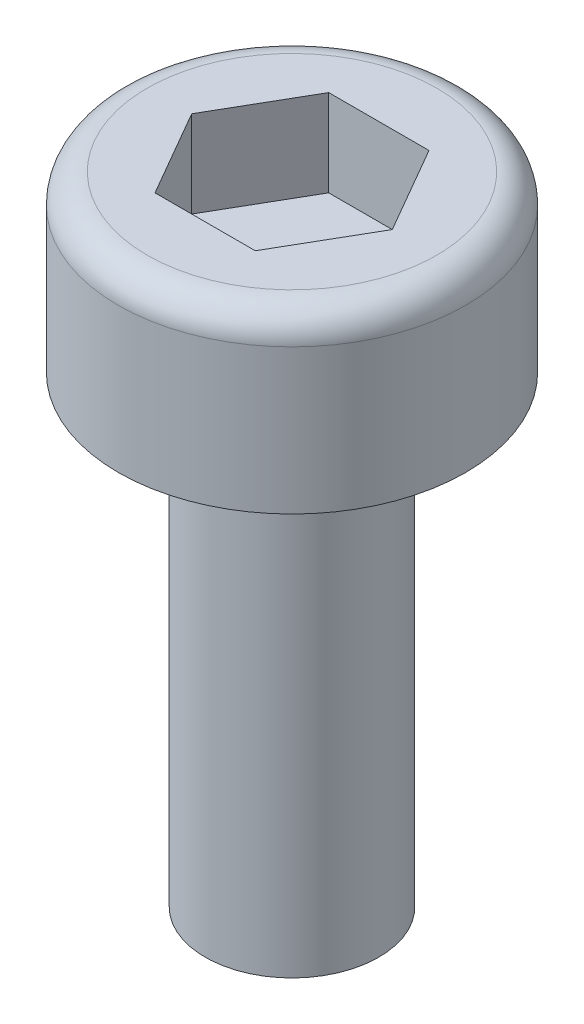
ISO-10303-21;
HEADER;
FILE_DESCRIPTION(('STEP AP214'),'2;1');
FILE_NAME('part.step','',(''),(''),'','','');
FILE_SCHEMA(('AUTOMOTIVE_DESIGN { 1 0 10303 214 1 1 1 1 }'));
ENDSEC;
DATA;
#1=APPLICATION_CONTEXT('core data for automotive mechanical design processes');
#2=APPLICATION_PROTOCOL_DEFINITION('international standard','automotive_design',2000,#1);
#3=PRODUCT_CONTEXT('',#1,'mechanical');
#4=PRODUCT('Part','Part','',(#3));
#5=PRODUCT_RELATED_PRODUCT_CATEGORY('part','',(#4));
#6=PRODUCT_DEFINITION_FORMATION('','',#4);
#7=PRODUCT_DEFINITION_CONTEXT('part definition',#1,'design');
#8=PRODUCT_DEFINITION('design','',#6,#7);
#9=PRODUCT_DEFINITION_SHAPE('','',#8);
#10=(LENGTH_UNIT() NAMED_UNIT(*) SI_UNIT(.MILLI.,.METRE.));
#11=(NAMED_UNIT(*) PLANE_ANGLE_UNIT() SI_UNIT($,.RADIAN.));
#12=(NAMED_UNIT(*) SI_UNIT($,.STERADIAN.) SOLID_ANGLE_UNIT());
#13=UNCERTAINTY_MEASURE_WITH_UNIT(LENGTH_MEASURE(1.E-05),#10,'distance_accuracy_value','');
#14=(GEOMETRIC_REPRESENTATION_CONTEXT(3) GLOBAL_UNCERTAINTY_ASSIGNED_CONTEXT((#13)) GLOBAL_UNIT_ASSIGNED_CONTEXT((#10,
#11,#12)) REPRESENTATION_CONTEXT('',''));
#15=CARTESIAN_POINT('',(0.,0.,0.));
#16=DIRECTION('',(0.,0.,1.));
#17=DIRECTION('',(1.,0.,0.));
#18=AXIS2_PLACEMENT_3D('',#15,#16,#17);
#19=CARTESIAN_POINT('',(0.,0.,0.));
#20=DIRECTION('',(0.,-1.,0.));
#21=DIRECTION('',(0.,0.,-1.));
#22=AXIS2_PLACEMENT_3D('',#19,#20,#21);
#23=PLANE('',#22);
#24=CARTESIAN_POINT('',(0.,0.,0.));
#25=DIRECTION('',(0.,-1.,0.));
#26=DIRECTION('',(0.,0.,-1.));
#27=AXIS2_PLACEMENT_3D('',#24,#25,#26);
#28=CIRCLE('',#27,3.);
#29=CARTESIAN_POINT('',(0.,0.,-3.));
#30=VERTEX_POINT('',#29);
#31=EDGE_CURVE('E145',#30,#30,#28,.T.);
#32=ORIENTED_EDGE('',*,*,#31,.T.);
#33=EDGE_LOOP('',(#32));
#34=FACE_BOUND('',#33,.T.);
#35=ADVANCED_FACE('F32',(#34),#23,.T.);
#36=CARTESIAN_POINT('',(0.,0.,0.));
#37=DIRECTION('',(0.,-1.,0.));
#38=DIRECTION('',(0.,0.,-1.));
#39=AXIS2_PLACEMENT_3D('',#36,#37,#38);
#40=CYLINDRICAL_SURFACE('',#39,3.);
#41=CARTESIAN_POINT('',(0.,16.,0.));
#42=DIRECTION('',(0.,-1.,0.));
#43=DIRECTION('',(0.,0.,-1.));
#44=AXIS2_PLACEMENT_3D('',#41,#42,#43);
#45=CIRCLE('',#44,3.);
#46=CARTESIAN_POINT('',(0.,16.,-3.));
#47=VERTEX_POINT('',#46);
#48=EDGE_CURVE('E142',#47,#47,#45,.T.);
#49=ORIENTED_EDGE('',*,*,#48,.T.);
#50=EDGE_LOOP('',(#49));
#51=FACE_BOUND('',#50,.T.);
#52=ORIENTED_EDGE('',*,*,#31,.F.);
#53=EDGE_LOOP('',(#52));
#54=FACE_BOUND('',#53,.T.);
#55=ADVANCED_FACE('F162',(#51,#54),#40,.T.);
#56=CARTESIAN_POINT('',(3.,16.,0.));
#57=DIRECTION('',(0.,-1.,0.));
#58=DIRECTION('',(0.,0.,-1.));
#59=AXIS2_PLACEMENT_3D('',#56,#57,#58);
#60=PLANE('',#59);
#61=CARTESIAN_POINT('',(0.,16.,0.));
#62=DIRECTION('',(0.,-1.,0.));
#63=DIRECTION('',(0.,0.,-1.));
#64=AXIS2_PLACEMENT_3D('',#61,#62,#63);
#65=CIRCLE('',#64,6.);
#66=CARTESIAN_POINT('',(0.,16.,-6.));
#67=VERTEX_POINT('',#66);
#68=EDGE_CURVE('E134',#67,#67,#65,.T.);
#69=ORIENTED_EDGE('',*,*,#68,.T.);
#70=EDGE_LOOP('',(#69));
#71=FACE_BOUND('',#70,.T.);
#72=ORIENTED_EDGE('',*,*,#48,.F.);
#73=EDGE_LOOP('',(#72));
#74=FACE_BOUND('',#73,.T.);
#75=ADVANCED_FACE('F167',(#71,#74),#60,.T.);
#76=CARTESIAN_POINT('',(0.,0.,0.));
#77=DIRECTION('',(0.,-1.,0.));
#78=DIRECTION('',(0.,0.,-1.));
#79=AXIS2_PLACEMENT_3D('',#76,#77,#78);
#80=CYLINDRICAL_SURFACE('',#79,6.);
#81=CARTESIAN_POINT('',(0.,21.,0.));
#82=DIRECTION('',(0.,1.,0.));
#83=DIRECTION('',(0.,0.,1.));
#84=AXIS2_PLACEMENT_3D('',#81,#82,#83);
#85=CIRCLE('',#84,6.);
#86=CARTESIAN_POINT('',(0.,21.,6.));
#87=VERTEX_POINT('',#86);
#88=EDGE_CURVE('E40',#87,#87,#85,.F.);
#89=ORIENTED_EDGE('',*,*,#88,.T.);
#90=EDGE_LOOP('',(#89));
#91=FACE_BOUND('',#90,.T.);
#92=ORIENTED_EDGE('',*,*,#68,.F.);
#93=EDGE_LOOP('',(#92));
#94=FACE_BOUND('',#93,.T.);
#95=ADVANCED_FACE('F150',(#91,#94),#80,.T.);
#96=CARTESIAN_POINT('',(6.,22.,0.));
#97=DIRECTION('',(0.,1.,0.));
#98=DIRECTION('',(0.,0.,1.));
#99=AXIS2_PLACEMENT_3D('',#96,#97,#98);
#100=PLANE('',#99);
#101=CARTESIAN_POINT('',(0.,22.,0.));
#102=DIRECTION('',(0.,1.,0.));
#103=DIRECTION('',(0.,0.,1.));
#104=AXIS2_PLACEMENT_3D('',#101,#102,#103);
#105=CIRCLE('',#104,5.);
#106=CARTESIAN_POINT('',(0.,22.,5.));
#107=VERTEX_POINT('',#106);
#108=EDGE_CURVE('E11',#107,#107,#105,.T.);
#109=ORIENTED_EDGE('',*,*,#108,.T.);
#110=EDGE_LOOP('',(#109));
#111=FACE_BOUND('',#110,.T.);
#112=DIRECTION('',(-0.5,0.,-0.866025403784438));
#113=VECTOR('',#112,1.);
#114=CARTESIAN_POINT('',(3.46410161513775,22.,0.));
#115=LINE('',#114,#113);
#116=CARTESIAN_POINT('',(3.46410161513775,22.,0.));
#117=VERTEX_POINT('',#116);
#118=CARTESIAN_POINT('',(1.73205080756888,22.,-3.));
#119=VERTEX_POINT('',#118);
#120=EDGE_CURVE('E47',#117,#119,#115,.T.);
#121=ORIENTED_EDGE('',*,*,#120,.F.);
#122=DIRECTION('',(0.5,0.,-0.866025403784439));
#123=VECTOR('',#122,1.);
#124=CARTESIAN_POINT('',(1.73205080756888,22.,3.));
#125=LINE('',#124,#123);
#126=CARTESIAN_POINT('',(1.73205080756888,22.,3.));
#127=VERTEX_POINT('',#126);
#128=EDGE_CURVE('E130',#127,#117,#125,.T.);
#129=ORIENTED_EDGE('',*,*,#128,.F.);
#130=DIRECTION('',(1.,0.,0.));
#131=VECTOR('',#130,1.);
#132=CARTESIAN_POINT('',(-1.73205080756888,22.,3.));
#133=LINE('',#132,#131);
#134=CARTESIAN_POINT('',(-1.73205080756888,22.,3.));
#135=VERTEX_POINT('',#134);
#136=EDGE_CURVE('E128',#135,#127,#133,.T.);
#137=ORIENTED_EDGE('',*,*,#136,.F.);
#138=DIRECTION('',(0.5,0.,0.866025403784438));
#139=VECTOR('',#138,1.);
#140=CARTESIAN_POINT('',(-3.46410161513775,22.,0.));
#141=LINE('',#140,#139);
#142=CARTESIAN_POINT('',(-3.46410161513775,22.,0.));
#143=VERTEX_POINT('',#142);
#144=EDGE_CURVE('E95',#143,#135,#141,.T.);
#145=ORIENTED_EDGE('',*,*,#144,.F.);
#146=DIRECTION('',(-0.5,0.,0.866025403784439));
#147=VECTOR('',#146,1.);
#148=CARTESIAN_POINT('',(-1.73205080756888,22.,-3.));
#149=LINE('',#148,#147);
#150=CARTESIAN_POINT('',(-1.73205080756888,22.,-3.));
#151=VERTEX_POINT('',#150);
#152=EDGE_CURVE('E124',#151,#143,#149,.T.);
#153=ORIENTED_EDGE('',*,*,#152,.F.);
#154=DIRECTION('',(-1.,0.,0.));
#155=VECTOR('',#154,1.);
#156=CARTESIAN_POINT('',(1.73205080756888,22.,-3.));
#157=LINE('',#156,#155);
#158=EDGE_CURVE('E121',#119,#151,#157,.T.);
#159=ORIENTED_EDGE('',*,*,#158,.F.);
#160=EDGE_LOOP('',(#121,#129,#137,#145,#153,#159));
#161=FACE_BOUND('',#160,.T.);
#162=ADVANCED_FACE('F176',(#111,#161),#100,.T.);
#163=CARTESIAN_POINT('',(3.46410161513775,19.,0.));
#164=DIRECTION('',(0.866025403784438,0.,-0.5));
#165=DIRECTION('',(-0.5,0.,-0.866025403784438));
#166=AXIS2_PLACEMENT_3D('',#163,#164,#165);
#167=PLANE('',#166);
#168=ORIENTED_EDGE('',*,*,#120,.T.);
#169=DIRECTION('',(0.,1.,0.));
#170=VECTOR('',#169,1.);
#171=CARTESIAN_POINT('',(1.73205080756888,19.,-3.));
#172=LINE('',#171,#170);
#173=CARTESIAN_POINT('',(1.73205080756888,19.,-3.));
#174=VERTEX_POINT('',#173);
#175=EDGE_CURVE('E77',#174,#119,#172,.T.);
#176=ORIENTED_EDGE('',*,*,#175,.F.);
#177=DIRECTION('',(-0.5,0.,-0.866025403784438));
#178=VECTOR('',#177,1.);
#179=CARTESIAN_POINT('',(3.46410161513775,19.,0.));
#180=LINE('',#179,#178);
#181=CARTESIAN_POINT('',(3.46410161513775,19.,0.));
#182=VERTEX_POINT('',#181);
#183=EDGE_CURVE('E132',#182,#174,#180,.T.);
#184=ORIENTED_EDGE('',*,*,#183,.F.);
#185=DIRECTION('',(0.,1.,0.));
#186=VECTOR('',#185,1.);
#187=CARTESIAN_POINT('',(3.46410161513775,19.,0.));
#188=LINE('',#187,#186);
#189=EDGE_CURVE('E55',#182,#117,#188,.T.);
#190=ORIENTED_EDGE('',*,*,#189,.T.);
#191=EDGE_LOOP('',(#168,#176,#184,#190));
#192=FACE_BOUND('',#191,.T.);
#193=ADVANCED_FACE('F179',(#192),#167,.F.);
#194=CARTESIAN_POINT('',(1.73205080756888,19.,3.));
#195=DIRECTION('',(0.866025403784438,0.,0.5));
#196=DIRECTION('',(0.5,0.,-0.866025403784439));
#197=AXIS2_PLACEMENT_3D('',#194,#195,#196);
#198=PLANE('',#197);
#199=ORIENTED_EDGE('',*,*,#128,.T.);
#200=ORIENTED_EDGE('',*,*,#189,.F.);
#201=DIRECTION('',(0.5,0.,-0.866025403784439));
#202=VECTOR('',#201,1.);
#203=CARTESIAN_POINT('',(1.73205080756888,19.,3.));
#204=LINE('',#203,#202);
#205=CARTESIAN_POINT('',(1.73205080756888,19.,3.));
#206=VERTEX_POINT('',#205);
#207=EDGE_CURVE('E107',#206,#182,#204,.T.);
#208=ORIENTED_EDGE('',*,*,#207,.F.);
#209=DIRECTION('',(0.,1.,0.));
#210=VECTOR('',#209,1.);
#211=CARTESIAN_POINT('',(1.73205080756888,19.,3.));
#212=LINE('',#211,#210);
#213=EDGE_CURVE('E99',#206,#127,#212,.T.);
#214=ORIENTED_EDGE('',*,*,#213,.T.);
#215=EDGE_LOOP('',(#199,#200,#208,#214));
#216=FACE_BOUND('',#215,.T.);
#217=ADVANCED_FACE('F183',(#216),#198,.F.);
#218=CARTESIAN_POINT('',(-1.73205080756888,19.,3.));
#219=DIRECTION('',(0.,0.,1.));
#220=DIRECTION('',(1.,0.,0.));
#221=AXIS2_PLACEMENT_3D('',#218,#219,#220);
#222=PLANE('',#221);
#223=ORIENTED_EDGE('',*,*,#136,.T.);
#224=ORIENTED_EDGE('',*,*,#213,.F.);
#225=DIRECTION('',(1.,0.,0.));
#226=VECTOR('',#225,1.);
#227=CARTESIAN_POINT('',(-1.73205080756888,19.,3.));
#228=LINE('',#227,#226);
#229=CARTESIAN_POINT('',(-1.73205080756888,19.,3.));
#230=VERTEX_POINT('',#229);
#231=EDGE_CURVE('E103',#230,#206,#228,.T.);
#232=ORIENTED_EDGE('',*,*,#231,.F.);
#233=DIRECTION('',(0.,1.,0.));
#234=VECTOR('',#233,1.);
#235=CARTESIAN_POINT('',(-1.73205080756888,19.,3.));
#236=LINE('',#235,#234);
#237=EDGE_CURVE('E88',#230,#135,#236,.T.);
#238=ORIENTED_EDGE('',*,*,#237,.T.);
#239=EDGE_LOOP('',(#223,#224,#232,#238));
#240=FACE_BOUND('',#239,.T.);
#241=ADVANCED_FACE('F104',(#240),#222,.F.);
#242=CARTESIAN_POINT('',(-3.46410161513775,19.,0.));
#243=DIRECTION('',(-0.866025403784439,0.,0.5));
#244=DIRECTION('',(0.5,0.,0.866025403784439));
#245=AXIS2_PLACEMENT_3D('',#242,#243,#244);
#246=PLANE('',#245);
#247=ORIENTED_EDGE('',*,*,#144,.T.);
#248=ORIENTED_EDGE('',*,*,#237,.F.);
#249=DIRECTION('',(0.5,0.,0.866025403784438));
#250=VECTOR('',#249,1.);
#251=CARTESIAN_POINT('',(-3.46410161513775,19.,0.));
#252=LINE('',#251,#250);
#253=CARTESIAN_POINT('',(-3.46410161513775,19.,0.));
#254=VERTEX_POINT('',#253);
#255=EDGE_CURVE('E92',#254,#230,#252,.T.);
#256=ORIENTED_EDGE('',*,*,#255,.F.);
#257=DIRECTION('',(0.,1.,0.));
#258=VECTOR('',#257,1.);
#259=CARTESIAN_POINT('',(-3.46410161513775,19.,0.));
#260=LINE('',#259,#258);
#261=EDGE_CURVE('E100',#254,#143,#260,.T.);
#262=ORIENTED_EDGE('',*,*,#261,.T.);
#263=EDGE_LOOP('',(#247,#248,#256,#262));
#264=FACE_BOUND('',#263,.T.);
#265=ADVANCED_FACE('F90',(#264),#246,.F.);
#266=CARTESIAN_POINT('',(-1.73205080756888,19.,-3.));
#267=DIRECTION('',(-0.866025403784438,0.,-0.5));
#268=DIRECTION('',(-0.5,0.,0.866025403784439));
#269=AXIS2_PLACEMENT_3D('',#266,#267,#268);
#270=PLANE('',#269);
#271=ORIENTED_EDGE('',*,*,#152,.T.);
#272=ORIENTED_EDGE('',*,*,#261,.F.);
#273=DIRECTION('',(-0.5,0.,0.866025403784439));
#274=VECTOR('',#273,1.);
#275=CARTESIAN_POINT('',(-1.73205080756888,19.,-3.));
#276=LINE('',#275,#274);
#277=CARTESIAN_POINT('',(-1.73205080756888,19.,-3.));
#278=VERTEX_POINT('',#277);
#279=EDGE_CURVE('E113',#278,#254,#276,.T.);
#280=ORIENTED_EDGE('',*,*,#279,.F.);
#281=DIRECTION('',(0.,1.,0.));
#282=VECTOR('',#281,1.);
#283=CARTESIAN_POINT('',(-1.73205080756888,19.,-3.));
#284=LINE('',#283,#282);
#285=EDGE_CURVE('E137',#278,#151,#284,.T.);
#286=ORIENTED_EDGE('',*,*,#285,.T.);
#287=EDGE_LOOP('',(#271,#272,#280,#286));
#288=FACE_BOUND('',#287,.T.);
#289=ADVANCED_FACE('F186',(#288),#270,.F.);
#290=CARTESIAN_POINT('',(1.73205080756888,19.,-3.));
#291=DIRECTION('',(0.,0.,-1.));
#292=DIRECTION('',(-1.,0.,0.));
#293=AXIS2_PLACEMENT_3D('',#290,#291,#292);
#294=PLANE('',#293);
#295=ORIENTED_EDGE('',*,*,#158,.T.);
#296=ORIENTED_EDGE('',*,*,#285,.F.);
#297=DIRECTION('',(-1.,0.,0.));
#298=VECTOR('',#297,1.);
#299=CARTESIAN_POINT('',(1.73205080756888,19.,-3.));
#300=LINE('',#299,#298);
#301=EDGE_CURVE('E115',#174,#278,#300,.T.);
#302=ORIENTED_EDGE('',*,*,#301,.F.);
#303=ORIENTED_EDGE('',*,*,#175,.T.);
#304=EDGE_LOOP('',(#295,#296,#302,#303));
#305=FACE_BOUND('',#304,.T.);
#306=ADVANCED_FACE('F158',(#305),#294,.F.);
#307=CARTESIAN_POINT('',(0.,19.,0.));
#308=DIRECTION('',(0.,1.,0.));
#309=DIRECTION('',(0.,0.,1.));
#310=AXIS2_PLACEMENT_3D('',#307,#308,#309);
#311=PLANE('',#310);
#312=ORIENTED_EDGE('',*,*,#183,.T.);
#313=ORIENTED_EDGE('',*,*,#301,.T.);
#314=ORIENTED_EDGE('',*,*,#279,.T.);
#315=ORIENTED_EDGE('',*,*,#255,.T.);
#316=ORIENTED_EDGE('',*,*,#231,.T.);
#317=ORIENTED_EDGE('',*,*,#207,.T.);
#318=EDGE_LOOP('',(#312,#313,#314,#315,#316,#317));
#319=FACE_BOUND('',#318,.T.);
#320=ADVANCED_FACE('F110',(#319),#311,.T.);
#321=CARTESIAN_POINT('',(0.,21.,0.));
#322=DIRECTION('',(0.,1.,0.));
#323=DIRECTION('',(0.,0.,1.));
#324=AXIS2_PLACEMENT_3D('',#321,#322,#323);
#325=TOROIDAL_SURFACE('',#324,5.,1.);
#326=ORIENTED_EDGE('',*,*,#108,.F.);
#327=EDGE_LOOP('',(#326));
#328=FACE_BOUND('',#327,.T.);
#329=ORIENTED_EDGE('',*,*,#88,.F.);
#330=EDGE_LOOP('',(#329));
#331=FACE_BOUND('',#330,.T.);
#332=ADVANCED_FACE('F34',(#328,#331),#325,.T.);
#333=CLOSED_SHELL('',(#35,#55,#75,#95,#162,#193,#217,#241,#265,#289,#306,#320,#332));
#334=MANIFOLD_SOLID_BREP('B2',#333);
#335=ADVANCED_BREP_SHAPE_REPRESENTATION('',(#18,#334),#14);
#336=SHAPE_DEFINITION_REPRESENTATION(#9,#335);
ENDSEC;
END-ISO-10303-21;
